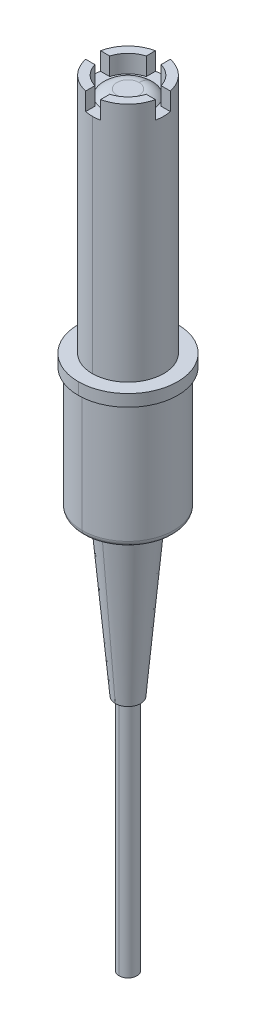
ISO-10303-21;
HEADER;
FILE_DESCRIPTION(('STEP AP214'),'2;1');
FILE_NAME('part.step','',(''),(''),'','','');
FILE_SCHEMA(('AUTOMOTIVE_DESIGN { 1 0 10303 214 1 1 1 1 }'));
ENDSEC;
DATA;
#1=APPLICATION_CONTEXT('core data for automotive mechanical design processes');
#2=APPLICATION_PROTOCOL_DEFINITION('international standard','automotive_design',2000,#1);
#3=PRODUCT_CONTEXT('',#1,'mechanical');
#4=PRODUCT('Part','Part','',(#3));
#5=PRODUCT_RELATED_PRODUCT_CATEGORY('part','',(#4));
#6=PRODUCT_DEFINITION_FORMATION('','',#4);
#7=PRODUCT_DEFINITION_CONTEXT('part definition',#1,'design');
#8=PRODUCT_DEFINITION('design','',#6,#7);
#9=PRODUCT_DEFINITION_SHAPE('','',#8);
#10=(LENGTH_UNIT() NAMED_UNIT(*) SI_UNIT(.MILLI.,.METRE.));
#11=(NAMED_UNIT(*) PLANE_ANGLE_UNIT() SI_UNIT($,.RADIAN.));
#12=(NAMED_UNIT(*) SI_UNIT($,.STERADIAN.) SOLID_ANGLE_UNIT());
#13=UNCERTAINTY_MEASURE_WITH_UNIT(LENGTH_MEASURE(1.E-05),#10,'distance_accuracy_value','');
#14=(GEOMETRIC_REPRESENTATION_CONTEXT(3) GLOBAL_UNCERTAINTY_ASSIGNED_CONTEXT((#13)) GLOBAL_UNIT_ASSIGNED_CONTEXT((#10,
#11,#12)) REPRESENTATION_CONTEXT('',''));
#15=CARTESIAN_POINT('',(0.,0.,0.));
#16=DIRECTION('',(0.,0.,1.));
#17=DIRECTION('',(1.,0.,0.));
#18=AXIS2_PLACEMENT_3D('',#15,#16,#17);
#19=CARTESIAN_POINT('',(0.,-67.,0.));
#20=DIRECTION('',(0.,-1.,0.));
#21=DIRECTION('',(0.,0.,-1.));
#22=AXIS2_PLACEMENT_3D('',#19,#20,#21);
#23=PLANE('',#22);
#24=CARTESIAN_POINT('',(0.,-67.,0.));
#25=DIRECTION('',(0.,-1.,0.));
#26=DIRECTION('',(0.,0.,-1.));
#27=AXIS2_PLACEMENT_3D('',#24,#25,#26);
#28=CIRCLE('',#27,1.5);
#29=CARTESIAN_POINT('',(0.,-67.,1.5));
#30=VERTEX_POINT('',#29);
#31=CARTESIAN_POINT('',(0.,-67.,-1.5));
#32=VERTEX_POINT('',#31);
#33=EDGE_CURVE('E10',#30,#32,#28,.T.);
#34=ORIENTED_EDGE('',*,*,#33,.T.);
#35=CARTESIAN_POINT('',(0.,-67.,0.));
#36=DIRECTION('',(0.,-1.,0.));
#37=DIRECTION('',(0.,0.,-1.));
#38=AXIS2_PLACEMENT_3D('',#35,#36,#37);
#39=CIRCLE('',#38,1.5);
#40=EDGE_CURVE('E340',#32,#30,#39,.T.);
#41=ORIENTED_EDGE('',*,*,#40,.T.);
#42=EDGE_LOOP('',(#34,#41));
#43=FACE_BOUND('',#42,.T.);
#44=ADVANCED_FACE('F16',(#43),#23,.T.);
#45=CARTESIAN_POINT('',(0.,-67.,0.));
#46=DIRECTION('',(0.,1.,0.));
#47=DIRECTION('',(0.,0.,1.));
#48=AXIS2_PLACEMENT_3D('',#45,#46,#47);
#49=CYLINDRICAL_SURFACE('',#48,1.5);
#50=DIRECTION('',(0.,1.,0.));
#51=VECTOR('',#50,1.);
#52=CARTESIAN_POINT('',(0.,-67.,-1.5));
#53=LINE('',#52,#51);
#54=CARTESIAN_POINT('',(0.,-27.,-1.5));
#55=VERTEX_POINT('',#54);
#56=EDGE_CURVE('E461',#32,#55,#53,.T.);
#57=ORIENTED_EDGE('',*,*,#56,.F.);
#58=ORIENTED_EDGE('',*,*,#33,.F.);
#59=DIRECTION('',(0.,1.,0.));
#60=VECTOR('',#59,1.);
#61=CARTESIAN_POINT('',(0.,-67.,1.5));
#62=LINE('',#61,#60);
#63=CARTESIAN_POINT('',(0.,-27.,1.5));
#64=VERTEX_POINT('',#63);
#65=EDGE_CURVE('E488',#30,#64,#62,.T.);
#66=ORIENTED_EDGE('',*,*,#65,.T.);
#67=CARTESIAN_POINT('',(0.,-27.,0.));
#68=DIRECTION('',(0.,-1.,0.));
#69=DIRECTION('',(0.,0.,-1.));
#70=AXIS2_PLACEMENT_3D('',#67,#68,#69);
#71=CIRCLE('',#70,1.5);
#72=EDGE_CURVE('E27',#64,#55,#71,.T.);
#73=ORIENTED_EDGE('',*,*,#72,.T.);
#74=EDGE_LOOP('',(#57,#58,#66,#73));
#75=FACE_BOUND('',#74,.T.);
#76=ADVANCED_FACE('F662',(#75),#49,.T.);
#77=CARTESIAN_POINT('',(0.,-27.,0.));
#78=DIRECTION('',(0.,-1.,0.));
#79=DIRECTION('',(0.,0.,-1.));
#80=AXIS2_PLACEMENT_3D('',#77,#78,#79);
#81=PLANE('',#80);
#82=ORIENTED_EDGE('',*,*,#72,.F.);
#83=CARTESIAN_POINT('',(0.,-27.,0.));
#84=DIRECTION('',(0.,-1.,0.));
#85=DIRECTION('',(0.,0.,-1.));
#86=AXIS2_PLACEMENT_3D('',#83,#84,#85);
#87=CIRCLE('',#86,1.5);
#88=EDGE_CURVE('E465',#55,#64,#87,.T.);
#89=ORIENTED_EDGE('',*,*,#88,.F.);
#90=EDGE_LOOP('',(#82,#89));
#91=FACE_BOUND('',#90,.T.);
#92=CARTESIAN_POINT('',(0.,-27.,0.));
#93=DIRECTION('',(0.,-1.,0.));
#94=DIRECTION('',(0.,0.,-1.));
#95=AXIS2_PLACEMENT_3D('',#92,#93,#94);
#96=CIRCLE('',#95,2.13780608480005);
#97=CARTESIAN_POINT('',(0.,-27.,-2.13780608480005));
#98=VERTEX_POINT('',#97);
#99=CARTESIAN_POINT('',(0.,-27.,2.13780608480005));
#100=VERTEX_POINT('',#99);
#101=EDGE_CURVE('E370',#98,#100,#96,.T.);
#102=ORIENTED_EDGE('',*,*,#101,.T.);
#103=CARTESIAN_POINT('',(0.,-27.,0.));
#104=DIRECTION('',(0.,-1.,0.));
#105=DIRECTION('',(0.,0.,-1.));
#106=AXIS2_PLACEMENT_3D('',#103,#104,#105);
#107=CIRCLE('',#106,2.13780608480005);
#108=EDGE_CURVE('E470',#100,#98,#107,.T.);
#109=ORIENTED_EDGE('',*,*,#108,.T.);
#110=EDGE_LOOP('',(#102,#109));
#111=FACE_BOUND('',#110,.T.);
#112=ADVANCED_FACE('F668',(#91,#111),#81,.T.);
#113=CARTESIAN_POINT('',(0.,0.,0.));
#114=DIRECTION('',(0.,1.,0.));
#115=DIRECTION('',(0.,0.,-1.));
#116=AXIS2_PLACEMENT_3D('',#113,#114,#115);
#117=CONICAL_SURFACE('',#116,4.5,0.0872664625997163);
#118=DIRECTION('',(0.,0.996194698091746,0.0871557427476582));
#119=VECTOR('',#118,1.);
#120=CARTESIAN_POINT('',(0.,0.,4.5));
#121=LINE('',#120,#119);
#122=CARTESIAN_POINT('',(0.,0.,4.5));
#123=VERTEX_POINT('',#122);
#124=EDGE_CURVE('E466',#100,#123,#121,.T.);
#125=ORIENTED_EDGE('',*,*,#124,.F.);
#126=ORIENTED_EDGE('',*,*,#101,.F.);
#127=DIRECTION('',(0.,0.996194698091746,-0.0871557427476582));
#128=VECTOR('',#127,1.);
#129=CARTESIAN_POINT('',(0.,0.,-4.5));
#130=LINE('',#129,#128);
#131=CARTESIAN_POINT('',(0.,0.,-4.5));
#132=VERTEX_POINT('',#131);
#133=EDGE_CURVE('E388',#98,#132,#130,.T.);
#134=ORIENTED_EDGE('',*,*,#133,.T.);
#135=CARTESIAN_POINT('',(0.,0.,0.));
#136=DIRECTION('',(0.,-1.,0.));
#137=DIRECTION('',(0.,0.,1.));
#138=AXIS2_PLACEMENT_3D('',#135,#136,#137);
#139=CIRCLE('',#138,4.5);
#140=EDGE_CURVE('E397',#132,#123,#139,.T.);
#141=ORIENTED_EDGE('',*,*,#140,.T.);
#142=EDGE_LOOP('',(#125,#126,#134,#141));
#143=FACE_BOUND('',#142,.T.);
#144=ADVANCED_FACE('F690',(#143),#117,.T.);
#145=CARTESIAN_POINT('',(0.,58.5,0.));
#146=DIRECTION('',(0.,-1.,0.));
#147=DIRECTION('',(0.,0.,-1.));
#148=AXIS2_PLACEMENT_3D('',#145,#146,#147);
#149=DEGENERATE_TOROIDAL_SURFACE('',#148,1.86393202250021,3.,.T.);
#150=CARTESIAN_POINT('',(0.,58.5,1.86393202250021));
#151=DIRECTION('',(1.,0.,0.));
#152=DIRECTION('',(0.,0.,-1.));
#153=AXIS2_PLACEMENT_3D('',#150,#151,#152);
#154=CIRCLE('',#153,3.);
#155=CARTESIAN_POINT('',(0.,61.5,1.86393202250021));
#156=VERTEX_POINT('',#155);
#157=CARTESIAN_POINT('',(0.,60.5,4.1));
#158=VERTEX_POINT('',#157);
#159=EDGE_CURVE('E421',#156,#158,#154,.T.);
#160=ORIENTED_EDGE('',*,*,#159,.F.);
#161=CARTESIAN_POINT('',(0.,61.5,0.));
#162=DIRECTION('',(0.,1.,0.));
#163=DIRECTION('',(0.,0.,1.));
#164=AXIS2_PLACEMENT_3D('',#161,#162,#163);
#165=CIRCLE('',#164,1.86393202250021);
#166=CARTESIAN_POINT('',(0.,61.5,-1.86393202250021));
#167=VERTEX_POINT('',#166);
#168=EDGE_CURVE('E579',#167,#156,#165,.T.);
#169=ORIENTED_EDGE('',*,*,#168,.F.);
#170=CARTESIAN_POINT('',(0.,58.5,-1.86393202250021));
#171=DIRECTION('',(-1.,0.,0.));
#172=DIRECTION('',(0.,0.,1.));
#173=AXIS2_PLACEMENT_3D('',#170,#171,#172);
#174=CIRCLE('',#173,3.);
#175=CARTESIAN_POINT('',(0.,60.5,-4.1));
#176=VERTEX_POINT('',#175);
#177=EDGE_CURVE('E492',#167,#176,#174,.T.);
#178=ORIENTED_EDGE('',*,*,#177,.T.);
#179=CARTESIAN_POINT('',(0.,60.5,0.));
#180=DIRECTION('',(0.,1.,0.));
#181=DIRECTION('',(0.,0.,1.));
#182=AXIS2_PLACEMENT_3D('',#179,#180,#181);
#183=CIRCLE('',#182,4.1);
#184=EDGE_CURVE('E456',#176,#158,#183,.T.);
#185=ORIENTED_EDGE('',*,*,#184,.T.);
#186=EDGE_LOOP('',(#160,#169,#178,#185));
#187=FACE_BOUND('',#186,.T.);
#188=ADVANCED_FACE('F685',(#187),#149,.T.);
#189=CARTESIAN_POINT('',(0.,61.5,0.));
#190=DIRECTION('',(0.,1.,0.));
#191=DIRECTION('',(1.,0.,0.));
#192=AXIS2_PLACEMENT_3D('',#189,#190,#191);
#193=PLANE('',#192);
#194=ORIENTED_EDGE('',*,*,#168,.T.);
#195=CARTESIAN_POINT('',(0.,61.5,0.));
#196=DIRECTION('',(0.,1.,0.));
#197=DIRECTION('',(0.,0.,1.));
#198=AXIS2_PLACEMENT_3D('',#195,#196,#197);
#199=CIRCLE('',#198,1.86393202250021);
#200=EDGE_CURVE('E392',#156,#167,#199,.T.);
#201=ORIENTED_EDGE('',*,*,#200,.T.);
#202=EDGE_LOOP('',(#194,#201));
#203=FACE_BOUND('',#202,.T.);
#204=ADVANCED_FACE('F673',(#203),#193,.T.);
#205=CARTESIAN_POINT('',(0.,60.5,1.25));
#206=DIRECTION('',(0.,0.,1.));
#207=DIRECTION('',(1.,0.,0.));
#208=AXIS2_PLACEMENT_3D('',#205,#206,#207);
#209=PLANE('',#208);
#210=DIRECTION('',(1.,0.,0.));
#211=VECTOR('',#210,1.);
#212=CARTESIAN_POINT('',(0.,63.5,1.25));
#213=LINE('',#212,#211);
#214=CARTESIAN_POINT('',(4.32290411644765,63.5,1.25));
#215=VERTEX_POINT('',#214);
#216=CARTESIAN_POINT('',(5.86834729715275,63.5,1.25));
#217=VERTEX_POINT('',#216);
#218=EDGE_CURVE('E277',#215,#217,#213,.T.);
#219=ORIENTED_EDGE('',*,*,#218,.T.);
#220=DIRECTION('',(0.,1.,0.));
#221=VECTOR('',#220,1.);
#222=CARTESIAN_POINT('',(5.86834729715275,60.5,1.25));
#223=LINE('',#222,#221);
#224=CARTESIAN_POINT('',(5.86834729715275,60.5,1.25));
#225=VERTEX_POINT('',#224);
#226=EDGE_CURVE('E358',#225,#217,#223,.T.);
#227=ORIENTED_EDGE('',*,*,#226,.F.);
#228=DIRECTION('',(1.,0.,0.));
#229=VECTOR('',#228,1.);
#230=CARTESIAN_POINT('',(0.,60.5,1.25));
#231=LINE('',#230,#229);
#232=CARTESIAN_POINT('',(4.32290411644765,60.5,1.25));
#233=VERTEX_POINT('',#232);
#234=EDGE_CURVE('E266',#233,#225,#231,.T.);
#235=ORIENTED_EDGE('',*,*,#234,.F.);
#236=DIRECTION('',(0.,1.,0.));
#237=VECTOR('',#236,1.);
#238=CARTESIAN_POINT('',(4.32290411644765,60.5,1.25));
#239=LINE('',#238,#237);
#240=EDGE_CURVE('E420',#233,#215,#239,.T.);
#241=ORIENTED_EDGE('',*,*,#240,.T.);
#242=EDGE_LOOP('',(#219,#227,#235,#241));
#243=FACE_BOUND('',#242,.T.);
#244=ADVANCED_FACE('F675',(#243),#209,.F.);
#245=CARTESIAN_POINT('',(0.,60.5,-1.25));
#246=DIRECTION('',(0.,0.,1.));
#247=DIRECTION('',(1.,0.,0.));
#248=AXIS2_PLACEMENT_3D('',#245,#246,#247);
#249=PLANE('',#248);
#250=DIRECTION('',(1.,0.,0.));
#251=VECTOR('',#250,1.);
#252=CARTESIAN_POINT('',(0.,63.5,-1.25));
#253=LINE('',#252,#251);
#254=CARTESIAN_POINT('',(4.32290411644765,63.5,-1.25));
#255=VERTEX_POINT('',#254);
#256=CARTESIAN_POINT('',(5.86834729715275,63.5,-1.25));
#257=VERTEX_POINT('',#256);
#258=EDGE_CURVE('E349',#255,#257,#253,.T.);
#259=ORIENTED_EDGE('',*,*,#258,.F.);
#260=DIRECTION('',(0.,1.,0.));
#261=VECTOR('',#260,1.);
#262=CARTESIAN_POINT('',(4.32290411644765,60.5,-1.25));
#263=LINE('',#262,#261);
#264=CARTESIAN_POINT('',(4.32290411644765,60.5,-1.25));
#265=VERTEX_POINT('',#264);
#266=EDGE_CURVE('E155',#265,#255,#263,.T.);
#267=ORIENTED_EDGE('',*,*,#266,.F.);
#268=DIRECTION('',(1.,0.,0.));
#269=VECTOR('',#268,1.);
#270=CARTESIAN_POINT('',(0.,60.5,-1.25));
#271=LINE('',#270,#269);
#272=CARTESIAN_POINT('',(5.86834729715275,60.5,-1.25));
#273=VERTEX_POINT('',#272);
#274=EDGE_CURVE('E396',#265,#273,#271,.T.);
#275=ORIENTED_EDGE('',*,*,#274,.T.);
#276=DIRECTION('',(0.,1.,0.));
#277=VECTOR('',#276,1.);
#278=CARTESIAN_POINT('',(5.86834729715275,60.5,-1.25));
#279=LINE('',#278,#277);
#280=EDGE_CURVE('E379',#273,#257,#279,.T.);
#281=ORIENTED_EDGE('',*,*,#280,.T.);
#282=EDGE_LOOP('',(#259,#267,#275,#281));
#283=FACE_BOUND('',#282,.T.);
#284=ADVANCED_FACE('F677',(#283),#249,.T.);
#285=CARTESIAN_POINT('',(1.25,60.5,0.));
#286=DIRECTION('',(1.,0.,0.));
#287=DIRECTION('',(0.,1.,0.));
#288=AXIS2_PLACEMENT_3D('',#285,#286,#287);
#289=PLANE('',#288);
#290=DIRECTION('',(0.,0.,-1.));
#291=VECTOR('',#290,1.);
#292=CARTESIAN_POINT('',(1.25,63.5,0.));
#293=LINE('',#292,#291);
#294=CARTESIAN_POINT('',(1.25,63.5,5.86834729715275));
#295=VERTEX_POINT('',#294);
#296=CARTESIAN_POINT('',(1.25,63.5,4.32290411644765));
#297=VERTEX_POINT('',#296);
#298=EDGE_CURVE('E506',#295,#297,#293,.T.);
#299=ORIENTED_EDGE('',*,*,#298,.T.);
#300=DIRECTION('',(0.,1.,0.));
#301=VECTOR('',#300,1.);
#302=CARTESIAN_POINT('',(1.25,60.5,4.32290411644765));
#303=LINE('',#302,#301);
#304=CARTESIAN_POINT('',(1.25,60.5,4.32290411644765));
#305=VERTEX_POINT('',#304);
#306=EDGE_CURVE('E354',#305,#297,#303,.T.);
#307=ORIENTED_EDGE('',*,*,#306,.F.);
#308=DIRECTION('',(0.,0.,-1.));
#309=VECTOR('',#308,1.);
#310=CARTESIAN_POINT('',(1.25,60.5,0.));
#311=LINE('',#310,#309);
#312=CARTESIAN_POINT('',(1.25,60.5,5.86834729715275));
#313=VERTEX_POINT('',#312);
#314=EDGE_CURVE('E42',#313,#305,#311,.T.);
#315=ORIENTED_EDGE('',*,*,#314,.F.);
#316=DIRECTION('',(0.,1.,0.));
#317=VECTOR('',#316,1.);
#318=CARTESIAN_POINT('',(1.25,60.5,5.86834729715275));
#319=LINE('',#318,#317);
#320=EDGE_CURVE('E434',#313,#295,#319,.T.);
#321=ORIENTED_EDGE('',*,*,#320,.T.);
#322=EDGE_LOOP('',(#299,#307,#315,#321));
#323=FACE_BOUND('',#322,.T.);
#324=ADVANCED_FACE('F682',(#323),#289,.F.);
#325=CARTESIAN_POINT('',(-1.25,60.5,0.));
#326=DIRECTION('',(1.,0.,0.));
#327=DIRECTION('',(0.,0.,-1.));
#328=AXIS2_PLACEMENT_3D('',#325,#326,#327);
#329=PLANE('',#328);
#330=DIRECTION('',(0.,0.,-1.));
#331=VECTOR('',#330,1.);
#332=CARTESIAN_POINT('',(-1.25,63.5,0.));
#333=LINE('',#332,#331);
#334=CARTESIAN_POINT('',(-1.25,63.5,5.86834729715275));
#335=VERTEX_POINT('',#334);
#336=CARTESIAN_POINT('',(-1.25,63.5,4.32290411644765));
#337=VERTEX_POINT('',#336);
#338=EDGE_CURVE('E341',#335,#337,#333,.T.);
#339=ORIENTED_EDGE('',*,*,#338,.F.);
#340=DIRECTION('',(0.,1.,0.));
#341=VECTOR('',#340,1.);
#342=CARTESIAN_POINT('',(-1.25,60.5,5.86834729715275));
#343=LINE('',#342,#341);
#344=CARTESIAN_POINT('',(-1.25,60.5,5.86834729715275));
#345=VERTEX_POINT('',#344);
#346=EDGE_CURVE('E538',#345,#335,#343,.T.);
#347=ORIENTED_EDGE('',*,*,#346,.F.);
#348=DIRECTION('',(0.,0.,-1.));
#349=VECTOR('',#348,1.);
#350=CARTESIAN_POINT('',(-1.25,60.5,0.));
#351=LINE('',#350,#349);
#352=CARTESIAN_POINT('',(-1.25,60.5,4.32290411644765));
#353=VERTEX_POINT('',#352);
#354=EDGE_CURVE('E20',#345,#353,#351,.T.);
#355=ORIENTED_EDGE('',*,*,#354,.T.);
#356=DIRECTION('',(0.,1.,0.));
#357=VECTOR('',#356,1.);
#358=CARTESIAN_POINT('',(-1.25,60.5,4.32290411644765));
#359=LINE('',#358,#357);
#360=EDGE_CURVE('E453',#353,#337,#359,.T.);
#361=ORIENTED_EDGE('',*,*,#360,.T.);
#362=EDGE_LOOP('',(#339,#347,#355,#361));
#363=FACE_BOUND('',#362,.T.);
#364=ADVANCED_FACE('F638',(#363),#329,.T.);
#365=CARTESIAN_POINT('',(-0.0055784842625831,60.5,1.26897914026433));
#366=DIRECTION('',(-0.00439599847134383,0.,0.999990337552038));
#367=DIRECTION('',(0.,1.,0.));
#368=AXIS2_PLACEMENT_3D('',#365,#366,#367);
#369=PLANE('',#368);
#370=DIRECTION('',(0.999990337552039,0.,0.00439599847134383));
#371=VECTOR('',#370,1.);
#372=CARTESIAN_POINT('',(-0.0055784842625831,63.5,1.26897914026433));
#373=LINE('',#372,#371);
#374=CARTESIAN_POINT('',(-5.86979166666667,63.5,1.2431998189875));
#375=VERTEX_POINT('',#374);
#376=CARTESIAN_POINT('',(-4.32290411644765,63.5,1.25));
#377=VERTEX_POINT('',#376);
#378=EDGE_CURVE('E313',#375,#377,#373,.T.);
#379=ORIENTED_EDGE('',*,*,#378,.T.);
#380=DIRECTION('',(0.,1.,0.));
#381=VECTOR('',#380,1.);
#382=CARTESIAN_POINT('',(-4.32290411644765,60.5,1.25));
#383=LINE('',#382,#381);
#384=CARTESIAN_POINT('',(-4.32290411644765,60.5,1.25));
#385=VERTEX_POINT('',#384);
#386=EDGE_CURVE('E440',#385,#377,#383,.T.);
#387=ORIENTED_EDGE('',*,*,#386,.F.);
#388=DIRECTION('',(0.999990337552039,0.,0.00439599847134383));
#389=VECTOR('',#388,1.);
#390=CARTESIAN_POINT('',(-0.0055784842625831,60.5,1.26897914026433));
#391=LINE('',#390,#389);
#392=CARTESIAN_POINT('',(-5.86979166666667,60.5,1.2431998189875));
#393=VERTEX_POINT('',#392);
#394=EDGE_CURVE('E568',#393,#385,#391,.T.);
#395=ORIENTED_EDGE('',*,*,#394,.F.);
#396=DIRECTION('',(0.,1.,0.));
#397=VECTOR('',#396,1.);
#398=CARTESIAN_POINT('',(-5.86979166666667,60.5,1.2431998189875));
#399=LINE('',#398,#397);
#400=EDGE_CURVE('E336',#393,#375,#399,.T.);
#401=ORIENTED_EDGE('',*,*,#400,.T.);
#402=EDGE_LOOP('',(#379,#387,#395,#401));
#403=FACE_BOUND('',#402,.T.);
#404=ADVANCED_FACE('F645',(#403),#369,.F.);
#405=CARTESIAN_POINT('',(0.,60.5,-1.25));
#406=DIRECTION('',(0.,0.,1.));
#407=DIRECTION('',(1.,0.,0.));
#408=AXIS2_PLACEMENT_3D('',#405,#406,#407);
#409=PLANE('',#408);
#410=DIRECTION('',(1.,0.,0.));
#411=VECTOR('',#410,1.);
#412=CARTESIAN_POINT('',(0.,63.5,-1.25));
#413=LINE('',#412,#411);
#414=CARTESIAN_POINT('',(-5.86834729715275,63.5,-1.25));
#415=VERTEX_POINT('',#414);
#416=CARTESIAN_POINT('',(-4.32290411644765,63.5,-1.25));
#417=VERTEX_POINT('',#416);
#418=EDGE_CURVE('E300',#415,#417,#413,.T.);
#419=ORIENTED_EDGE('',*,*,#418,.F.);
#420=DIRECTION('',(0.,1.,0.));
#421=VECTOR('',#420,1.);
#422=CARTESIAN_POINT('',(-5.86834729715275,60.5,-1.25));
#423=LINE('',#422,#421);
#424=CARTESIAN_POINT('',(-5.86834729715275,60.5,-1.25));
#425=VERTEX_POINT('',#424);
#426=EDGE_CURVE('E304',#425,#415,#423,.T.);
#427=ORIENTED_EDGE('',*,*,#426,.F.);
#428=DIRECTION('',(1.,0.,0.));
#429=VECTOR('',#428,1.);
#430=CARTESIAN_POINT('',(0.,60.5,-1.25));
#431=LINE('',#430,#429);
#432=CARTESIAN_POINT('',(-4.32290411644765,60.5,-1.25));
#433=VERTEX_POINT('',#432);
#434=EDGE_CURVE('E565',#425,#433,#431,.T.);
#435=ORIENTED_EDGE('',*,*,#434,.T.);
#436=DIRECTION('',(0.,1.,0.));
#437=VECTOR('',#436,1.);
#438=CARTESIAN_POINT('',(-4.32290411644765,60.5,-1.25));
#439=LINE('',#438,#437);
#440=EDGE_CURVE('E307',#433,#417,#439,.T.);
#441=ORIENTED_EDGE('',*,*,#440,.T.);
#442=EDGE_LOOP('',(#419,#427,#435,#441));
#443=FACE_BOUND('',#442,.T.);
#444=ADVANCED_FACE('F18',(#443),#409,.T.);
#445=CARTESIAN_POINT('',(1.25,60.5,0.));
#446=DIRECTION('',(1.,0.,0.));
#447=DIRECTION('',(0.,0.,-1.));
#448=AXIS2_PLACEMENT_3D('',#445,#446,#447);
#449=PLANE('',#448);
#450=DIRECTION('',(0.,0.,-1.));
#451=VECTOR('',#450,1.);
#452=CARTESIAN_POINT('',(1.25,63.5,0.));
#453=LINE('',#452,#451);
#454=CARTESIAN_POINT('',(1.25,63.5,-4.32290411644765));
#455=VERTEX_POINT('',#454);
#456=CARTESIAN_POINT('',(1.25,63.5,-5.86834729715275));
#457=VERTEX_POINT('',#456);
#458=EDGE_CURVE('E346',#455,#457,#453,.T.);
#459=ORIENTED_EDGE('',*,*,#458,.T.);
#460=DIRECTION('',(0.,1.,0.));
#461=VECTOR('',#460,1.);
#462=CARTESIAN_POINT('',(1.25,60.5,-5.86834729715275));
#463=LINE('',#462,#461);
#464=CARTESIAN_POINT('',(1.25,60.5,-5.86834729715275));
#465=VERTEX_POINT('',#464);
#466=EDGE_CURVE('E380',#465,#457,#463,.T.);
#467=ORIENTED_EDGE('',*,*,#466,.F.);
#468=DIRECTION('',(0.,0.,-1.));
#469=VECTOR('',#468,1.);
#470=CARTESIAN_POINT('',(1.25,60.5,0.));
#471=LINE('',#470,#469);
#472=CARTESIAN_POINT('',(1.25,60.5,-4.32290411644765));
#473=VERTEX_POINT('',#472);
#474=EDGE_CURVE('E112',#473,#465,#471,.T.);
#475=ORIENTED_EDGE('',*,*,#474,.F.);
#476=DIRECTION('',(0.,1.,0.));
#477=VECTOR('',#476,1.);
#478=CARTESIAN_POINT('',(1.25,60.5,-4.32290411644765));
#479=LINE('',#478,#477);
#480=EDGE_CURVE('E166',#473,#455,#479,.T.);
#481=ORIENTED_EDGE('',*,*,#480,.T.);
#482=EDGE_LOOP('',(#459,#467,#475,#481));
#483=FACE_BOUND('',#482,.T.);
#484=ADVANCED_FACE('F710',(#483),#449,.F.);
#485=CARTESIAN_POINT('',(-1.25,60.5,0.));
#486=DIRECTION('',(1.,0.,0.));
#487=DIRECTION('',(0.,1.,0.));
#488=AXIS2_PLACEMENT_3D('',#485,#486,#487);
#489=PLANE('',#488);
#490=DIRECTION('',(0.,0.,-1.));
#491=VECTOR('',#490,1.);
#492=CARTESIAN_POINT('',(-1.25,63.5,0.));
#493=LINE('',#492,#491);
#494=CARTESIAN_POINT('',(-1.25,63.5,-4.32290411644765));
#495=VERTEX_POINT('',#494);
#496=CARTESIAN_POINT('',(-1.25,63.5,-5.86834729715275));
#497=VERTEX_POINT('',#496);
#498=EDGE_CURVE('E319',#495,#497,#493,.T.);
#499=ORIENTED_EDGE('',*,*,#498,.F.);
#500=DIRECTION('',(0.,1.,0.));
#501=VECTOR('',#500,1.);
#502=CARTESIAN_POINT('',(-1.25,60.5,-4.32290411644765));
#503=LINE('',#502,#501);
#504=CARTESIAN_POINT('',(-1.25,60.5,-4.32290411644765));
#505=VERTEX_POINT('',#504);
#506=EDGE_CURVE('E447',#505,#495,#503,.T.);
#507=ORIENTED_EDGE('',*,*,#506,.F.);
#508=DIRECTION('',(0.,0.,-1.));
#509=VECTOR('',#508,1.);
#510=CARTESIAN_POINT('',(-1.25,60.5,0.));
#511=LINE('',#510,#509);
#512=CARTESIAN_POINT('',(-1.25,60.5,-5.86834729715275));
#513=VERTEX_POINT('',#512);
#514=EDGE_CURVE('E564',#505,#513,#511,.T.);
#515=ORIENTED_EDGE('',*,*,#514,.T.);
#516=DIRECTION('',(0.,1.,0.));
#517=VECTOR('',#516,1.);
#518=CARTESIAN_POINT('',(-1.25,60.5,-5.86834729715275));
#519=LINE('',#518,#517);
#520=EDGE_CURVE('E324',#513,#497,#519,.T.);
#521=ORIENTED_EDGE('',*,*,#520,.T.);
#522=EDGE_LOOP('',(#499,#507,#515,#521));
#523=FACE_BOUND('',#522,.T.);
#524=ADVANCED_FACE('F619',(#523),#489,.T.);
#525=CARTESIAN_POINT('',(0.,60.5,0.));
#526=DIRECTION('',(0.,1.,0.));
#527=DIRECTION('',(1.,0.,0.));
#528=AXIS2_PLACEMENT_3D('',#525,#526,#527);
#529=PLANE('',#528);
#530=ORIENTED_EDGE('',*,*,#184,.F.);
#531=CARTESIAN_POINT('',(0.,60.5,0.));
#532=DIRECTION('',(0.,1.,0.));
#533=DIRECTION('',(0.,0.,1.));
#534=AXIS2_PLACEMENT_3D('',#531,#532,#533);
#535=CIRCLE('',#534,4.1);
#536=EDGE_CURVE('E425',#158,#176,#535,.T.);
#537=ORIENTED_EDGE('',*,*,#536,.F.);
#538=EDGE_LOOP('',(#530,#537));
#539=FACE_BOUND('',#538,.T.);
#540=CARTESIAN_POINT('',(0.,60.5,0.));
#541=DIRECTION('',(0.,1.,0.));
#542=DIRECTION('',(0.,0.,1.));
#543=AXIS2_PLACEMENT_3D('',#540,#541,#542);
#544=CIRCLE('',#543,4.5);
#545=EDGE_CURVE('E407',#305,#233,#544,.T.);
#546=ORIENTED_EDGE('',*,*,#545,.T.);
#547=ORIENTED_EDGE('',*,*,#234,.T.);
#548=CARTESIAN_POINT('',(0.,60.5,0.));
#549=DIRECTION('',(0.,1.,0.));
#550=DIRECTION('',(0.,0.,1.));
#551=AXIS2_PLACEMENT_3D('',#548,#549,#550);
#552=CIRCLE('',#551,6.);
#553=EDGE_CURVE('E363',#225,#273,#552,.T.);
#554=ORIENTED_EDGE('',*,*,#553,.T.);
#555=ORIENTED_EDGE('',*,*,#274,.F.);
#556=CARTESIAN_POINT('',(0.,60.5,0.));
#557=DIRECTION('',(0.,1.,0.));
#558=DIRECTION('',(0.,0.,1.));
#559=AXIS2_PLACEMENT_3D('',#556,#557,#558);
#560=CIRCLE('',#559,4.5);
#561=EDGE_CURVE('E450',#265,#473,#560,.T.);
#562=ORIENTED_EDGE('',*,*,#561,.T.);
#563=ORIENTED_EDGE('',*,*,#474,.T.);
#564=CARTESIAN_POINT('',(0.,60.5,0.));
#565=DIRECTION('',(0.,1.,0.));
#566=DIRECTION('',(0.,0.,1.));
#567=AXIS2_PLACEMENT_3D('',#564,#565,#566);
#568=CIRCLE('',#567,6.);
#569=CARTESIAN_POINT('',(0.,60.5,-6.));
#570=VERTEX_POINT('',#569);
#571=EDGE_CURVE('E515',#465,#570,#568,.T.);
#572=ORIENTED_EDGE('',*,*,#571,.T.);
#573=CARTESIAN_POINT('',(0.,60.5,0.));
#574=DIRECTION('',(0.,1.,0.));
#575=DIRECTION('',(0.,0.,1.));
#576=AXIS2_PLACEMENT_3D('',#573,#574,#575);
#577=CIRCLE('',#576,6.);
#578=EDGE_CURVE('E367',#570,#513,#577,.T.);
#579=ORIENTED_EDGE('',*,*,#578,.T.);
#580=ORIENTED_EDGE('',*,*,#514,.F.);
#581=CARTESIAN_POINT('',(0.,60.5,0.));
#582=DIRECTION('',(0.,1.,0.));
#583=DIRECTION('',(0.,0.,1.));
#584=AXIS2_PLACEMENT_3D('',#581,#582,#583);
#585=CIRCLE('',#584,4.5);
#586=EDGE_CURVE('E439',#505,#433,#585,.T.);
#587=ORIENTED_EDGE('',*,*,#586,.T.);
#588=ORIENTED_EDGE('',*,*,#434,.F.);
#589=CARTESIAN_POINT('',(0.,60.5,0.));
#590=DIRECTION('',(0.,1.,0.));
#591=DIRECTION('',(0.,0.,1.));
#592=AXIS2_PLACEMENT_3D('',#589,#590,#591);
#593=CIRCLE('',#592,6.);
#594=EDGE_CURVE('E330',#425,#393,#593,.T.);
#595=ORIENTED_EDGE('',*,*,#594,.T.);
#596=ORIENTED_EDGE('',*,*,#394,.T.);
#597=CARTESIAN_POINT('',(0.,60.5,0.));
#598=DIRECTION('',(0.,1.,0.));
#599=DIRECTION('',(0.,0.,1.));
#600=AXIS2_PLACEMENT_3D('',#597,#598,#599);
#601=CIRCLE('',#600,4.5);
#602=EDGE_CURVE('E552',#385,#353,#601,.T.);
#603=ORIENTED_EDGE('',*,*,#602,.T.);
#604=ORIENTED_EDGE('',*,*,#354,.F.);
#605=CARTESIAN_POINT('',(0.,60.5,0.));
#606=DIRECTION('',(0.,1.,0.));
#607=DIRECTION('',(0.,0.,1.));
#608=AXIS2_PLACEMENT_3D('',#605,#606,#607);
#609=CIRCLE('',#608,6.);
#610=CARTESIAN_POINT('',(0.,60.5,6.));
#611=VERTEX_POINT('',#610);
#612=EDGE_CURVE('E460',#345,#611,#609,.T.);
#613=ORIENTED_EDGE('',*,*,#612,.T.);
#614=CARTESIAN_POINT('',(0.,60.5,0.));
#615=DIRECTION('',(0.,1.,0.));
#616=DIRECTION('',(0.,0.,1.));
#617=AXIS2_PLACEMENT_3D('',#614,#615,#616);
#618=CIRCLE('',#617,6.);
#619=EDGE_CURVE('E446',#611,#313,#618,.T.);
#620=ORIENTED_EDGE('',*,*,#619,.T.);
#621=ORIENTED_EDGE('',*,*,#314,.T.);
#622=EDGE_LOOP('',(#546,#547,#554,#555,#562,#563,#572,#579,#580,#587,#588,#595,#596,#603,#604,
#613,#620,#621));
#623=FACE_BOUND('',#622,.T.);
#624=ADVANCED_FACE('F614',(#539,#623),#529,.T.);
#625=CARTESIAN_POINT('',(0.,1.,0.));
#626=DIRECTION('',(0.,1.,0.));
#627=DIRECTION('',(0.,0.,1.));
#628=AXIS2_PLACEMENT_3D('',#625,#626,#627);
#629=TOROIDAL_SURFACE('',#628,6.7,1.);
#630=CARTESIAN_POINT('',(0.,1.,-6.7));
#631=DIRECTION('',(1.,0.,0.));
#632=DIRECTION('',(0.,0.,-1.));
#633=AXIS2_PLACEMENT_3D('',#630,#631,#632);
#634=CIRCLE('',#633,1.);
#635=CARTESIAN_POINT('',(0.,0.,-6.7));
#636=VERTEX_POINT('',#635);
#637=CARTESIAN_POINT('',(0.,1.,-7.7));
#638=VERTEX_POINT('',#637);
#639=EDGE_CURVE('E398',#636,#638,#634,.T.);
#640=ORIENTED_EDGE('',*,*,#639,.F.);
#641=CARTESIAN_POINT('',(0.,0.,0.));
#642=DIRECTION('',(0.,-1.,0.));
#643=DIRECTION('',(0.,0.,1.));
#644=AXIS2_PLACEMENT_3D('',#641,#642,#643);
#645=CIRCLE('',#644,6.7);
#646=CARTESIAN_POINT('',(0.,0.,6.7));
#647=VERTEX_POINT('',#646);
#648=EDGE_CURVE('E509',#647,#636,#645,.T.);
#649=ORIENTED_EDGE('',*,*,#648,.F.);
#650=CARTESIAN_POINT('',(0.,1.,6.7));
#651=DIRECTION('',(-1.,0.,0.));
#652=DIRECTION('',(0.,0.,1.));
#653=AXIS2_PLACEMENT_3D('',#650,#651,#652);
#654=CIRCLE('',#653,1.);
#655=CARTESIAN_POINT('',(0.,1.,7.7));
#656=VERTEX_POINT('',#655);
#657=EDGE_CURVE('E411',#647,#656,#654,.T.);
#658=ORIENTED_EDGE('',*,*,#657,.T.);
#659=CARTESIAN_POINT('',(0.,1.,0.));
#660=DIRECTION('',(0.,1.,0.));
#661=DIRECTION('',(0.,0.,1.));
#662=AXIS2_PLACEMENT_3D('',#659,#660,#661);
#663=CIRCLE('',#662,7.7);
#664=EDGE_CURVE('E374',#638,#656,#663,.T.);
#665=ORIENTED_EDGE('',*,*,#664,.F.);
#666=EDGE_LOOP('',(#640,#649,#658,#665));
#667=FACE_BOUND('',#666,.T.);
#668=ADVANCED_FACE('F701',(#667),#629,.T.);
#669=CARTESIAN_POINT('',(0.,0.,0.));
#670=DIRECTION('',(0.,1.,0.));
#671=DIRECTION('',(1.,0.,0.));
#672=AXIS2_PLACEMENT_3D('',#669,#670,#671);
#673=PLANE('',#672);
#674=ORIENTED_EDGE('',*,*,#140,.F.);
#675=CARTESIAN_POINT('',(0.,0.,0.));
#676=DIRECTION('',(0.,-1.,0.));
#677=DIRECTION('',(0.,0.,1.));
#678=AXIS2_PLACEMENT_3D('',#675,#676,#677);
#679=CIRCLE('',#678,4.5);
#680=EDGE_CURVE('E393',#123,#132,#679,.T.);
#681=ORIENTED_EDGE('',*,*,#680,.F.);
#682=EDGE_LOOP('',(#674,#681));
#683=FACE_BOUND('',#682,.T.);
#684=ORIENTED_EDGE('',*,*,#648,.T.);
#685=CARTESIAN_POINT('',(0.,0.,0.));
#686=DIRECTION('',(0.,-1.,0.));
#687=DIRECTION('',(0.,0.,1.));
#688=AXIS2_PLACEMENT_3D('',#685,#686,#687);
#689=CIRCLE('',#688,6.7);
#690=EDGE_CURVE('E403',#636,#647,#689,.T.);
#691=ORIENTED_EDGE('',*,*,#690,.T.);
#692=EDGE_LOOP('',(#684,#691));
#693=FACE_BOUND('',#692,.T.);
#694=ADVANCED_FACE('F707',(#683,#693),#673,.F.);
#695=CARTESIAN_POINT('',(0.,21.,0.));
#696=DIRECTION('',(0.,-1.,0.));
#697=DIRECTION('',(0.,0.,-1.));
#698=AXIS2_PLACEMENT_3D('',#695,#696,#697);
#699=CYLINDRICAL_SURFACE('',#698,7.7);
#700=DIRECTION('',(0.,-1.,0.));
#701=VECTOR('',#700,1.);
#702=CARTESIAN_POINT('',(0.,21.,7.7));
#703=LINE('',#702,#701);
#704=CARTESIAN_POINT('',(0.,21.,7.7));
#705=VERTEX_POINT('',#704);
#706=EDGE_CURVE('E412',#705,#656,#703,.T.);
#707=ORIENTED_EDGE('',*,*,#706,.F.);
#708=CARTESIAN_POINT('',(0.,21.,0.));
#709=DIRECTION('',(0.,-1.,0.));
#710=DIRECTION('',(0.,0.,-1.));
#711=AXIS2_PLACEMENT_3D('',#708,#709,#710);
#712=CIRCLE('',#711,7.7);
#713=CARTESIAN_POINT('',(0.,21.,-7.7));
#714=VERTEX_POINT('',#713);
#715=EDGE_CURVE('E371',#705,#714,#712,.T.);
#716=ORIENTED_EDGE('',*,*,#715,.T.);
#717=DIRECTION('',(0.,-1.,0.));
#718=VECTOR('',#717,1.);
#719=CARTESIAN_POINT('',(0.,21.,-7.7));
#720=LINE('',#719,#718);
#721=EDGE_CURVE('E416',#714,#638,#720,.T.);
#722=ORIENTED_EDGE('',*,*,#721,.T.);
#723=ORIENTED_EDGE('',*,*,#664,.T.);
#724=EDGE_LOOP('',(#707,#716,#722,#723));
#725=FACE_BOUND('',#724,.T.);
#726=ADVANCED_FACE('F730',(#725),#699,.T.);
#727=CARTESIAN_POINT('',(0.,21.,0.));
#728=DIRECTION('',(0.,-1.,0.));
#729=DIRECTION('',(0.,0.,-1.));
#730=AXIS2_PLACEMENT_3D('',#727,#728,#729);
#731=PLANE('',#730);
#732=CARTESIAN_POINT('',(0.,21.,0.));
#733=DIRECTION('',(0.,-1.,0.));
#734=DIRECTION('',(0.,0.,-1.));
#735=AXIS2_PLACEMENT_3D('',#732,#733,#734);
#736=CIRCLE('',#735,7.7);
#737=EDGE_CURVE('E417',#714,#705,#736,.T.);
#738=ORIENTED_EDGE('',*,*,#737,.F.);
#739=ORIENTED_EDGE('',*,*,#715,.F.);
#740=EDGE_LOOP('',(#738,#739));
#741=FACE_BOUND('',#740,.T.);
#742=CARTESIAN_POINT('',(0.,21.,0.));
#743=DIRECTION('',(0.,-1.,0.));
#744=DIRECTION('',(0.,0.,-1.));
#745=AXIS2_PLACEMENT_3D('',#742,#743,#744);
#746=CIRCLE('',#745,8.35);
#747=CARTESIAN_POINT('',(0.,21.,-8.35));
#748=VERTEX_POINT('',#747);
#749=CARTESIAN_POINT('',(0.,21.,8.35));
#750=VERTEX_POINT('',#749);
#751=EDGE_CURVE('E430',#748,#750,#746,.T.);
#752=ORIENTED_EDGE('',*,*,#751,.T.);
#753=CARTESIAN_POINT('',(0.,21.,0.));
#754=DIRECTION('',(0.,-1.,0.));
#755=DIRECTION('',(0.,0.,-1.));
#756=AXIS2_PLACEMENT_3D('',#753,#754,#755);
#757=CIRCLE('',#756,8.35);
#758=EDGE_CURVE('E353',#750,#748,#757,.T.);
#759=ORIENTED_EDGE('',*,*,#758,.T.);
#760=EDGE_LOOP('',(#752,#759));
#761=FACE_BOUND('',#760,.T.);
#762=ADVANCED_FACE('F767',(#741,#761),#731,.T.);
#763=CARTESIAN_POINT('',(0.,23.,0.));
#764=DIRECTION('',(0.,1.,0.));
#765=DIRECTION('',(1.,0.,0.));
#766=AXIS2_PLACEMENT_3D('',#763,#764,#765);
#767=PLANE('',#766);
#768=CARTESIAN_POINT('',(0.,23.,0.));
#769=DIRECTION('',(0.,1.,0.));
#770=DIRECTION('',(0.,0.,1.));
#771=AXIS2_PLACEMENT_3D('',#768,#769,#770);
#772=CIRCLE('',#771,6.);
#773=CARTESIAN_POINT('',(0.,23.,6.));
#774=VERTEX_POINT('',#773);
#775=CARTESIAN_POINT('',(0.,23.,-6.));
#776=VERTEX_POINT('',#775);
#777=EDGE_CURVE('E500',#774,#776,#772,.T.);
#778=ORIENTED_EDGE('',*,*,#777,.F.);
#779=CARTESIAN_POINT('',(0.,23.,0.));
#780=DIRECTION('',(0.,1.,0.));
#781=DIRECTION('',(0.,0.,1.));
#782=AXIS2_PLACEMENT_3D('',#779,#780,#781);
#783=CIRCLE('',#782,6.);
#784=EDGE_CURVE('E445',#776,#774,#783,.T.);
#785=ORIENTED_EDGE('',*,*,#784,.F.);
#786=EDGE_LOOP('',(#778,#785));
#787=FACE_BOUND('',#786,.T.);
#788=CARTESIAN_POINT('',(0.,23.,0.));
#789=DIRECTION('',(0.,1.,0.));
#790=DIRECTION('',(0.,0.,1.));
#791=AXIS2_PLACEMENT_3D('',#788,#789,#790);
#792=CIRCLE('',#791,8.35);
#793=CARTESIAN_POINT('',(0.,23.,-8.35));
#794=VERTEX_POINT('',#793);
#795=CARTESIAN_POINT('',(0.,23.,8.35));
#796=VERTEX_POINT('',#795);
#797=EDGE_CURVE('E350',#794,#796,#792,.T.);
#798=ORIENTED_EDGE('',*,*,#797,.T.);
#799=CARTESIAN_POINT('',(0.,23.,0.));
#800=DIRECTION('',(0.,1.,0.));
#801=DIRECTION('',(0.,0.,1.));
#802=AXIS2_PLACEMENT_3D('',#799,#800,#801);
#803=CIRCLE('',#802,8.35);
#804=EDGE_CURVE('E431',#796,#794,#803,.T.);
#805=ORIENTED_EDGE('',*,*,#804,.T.);
#806=EDGE_LOOP('',(#798,#805));
#807=FACE_BOUND('',#806,.T.);
#808=ADVANCED_FACE('F627',(#787,#807),#767,.T.);
#809=CARTESIAN_POINT('',(0.,63.5,0.));
#810=DIRECTION('',(0.,-1.,0.));
#811=DIRECTION('',(0.,0.,-1.));
#812=AXIS2_PLACEMENT_3D('',#809,#810,#811);
#813=CYLINDRICAL_SURFACE('',#812,8.35);
#814=DIRECTION('',(0.,-1.,0.));
#815=VECTOR('',#814,1.);
#816=CARTESIAN_POINT('',(0.,63.5,8.35));
#817=LINE('',#816,#815);
#818=EDGE_CURVE('E426',#796,#750,#817,.T.);
#819=ORIENTED_EDGE('',*,*,#818,.F.);
#820=ORIENTED_EDGE('',*,*,#797,.F.);
#821=DIRECTION('',(0.,-1.,0.));
#822=VECTOR('',#821,1.);
#823=CARTESIAN_POINT('',(0.,63.5,-8.35));
#824=LINE('',#823,#822);
#825=EDGE_CURVE('E496',#794,#748,#824,.T.);
#826=ORIENTED_EDGE('',*,*,#825,.T.);
#827=ORIENTED_EDGE('',*,*,#758,.F.);
#828=EDGE_LOOP('',(#819,#820,#826,#827));
#829=FACE_BOUND('',#828,.T.);
#830=ADVANCED_FACE('F724',(#829),#813,.T.);
#831=CARTESIAN_POINT('',(0.,60.5,0.));
#832=DIRECTION('',(0.,1.,0.));
#833=DIRECTION('',(0.,0.,1.));
#834=AXIS2_PLACEMENT_3D('',#831,#832,#833);
#835=CYLINDRICAL_SURFACE('',#834,4.5);
#836=CARTESIAN_POINT('',(0.,63.5,0.));
#837=DIRECTION('',(0.,1.,0.));
#838=DIRECTION('',(0.,0.,1.));
#839=AXIS2_PLACEMENT_3D('',#836,#837,#838);
#840=CIRCLE('',#839,4.5);
#841=EDGE_CURVE('E530',#297,#215,#840,.T.);
#842=ORIENTED_EDGE('',*,*,#841,.T.);
#843=ORIENTED_EDGE('',*,*,#240,.F.);
#844=ORIENTED_EDGE('',*,*,#545,.F.);
#845=ORIENTED_EDGE('',*,*,#306,.T.);
#846=EDGE_LOOP('',(#842,#843,#844,#845));
#847=FACE_BOUND('',#846,.T.);
#848=ADVANCED_FACE('F658',(#847),#835,.F.);
#849=CARTESIAN_POINT('',(0.,60.5,0.));
#850=DIRECTION('',(0.,1.,0.));
#851=DIRECTION('',(0.,0.,1.));
#852=AXIS2_PLACEMENT_3D('',#849,#850,#851);
#853=CYLINDRICAL_SURFACE('',#852,4.5);
#854=ORIENTED_EDGE('',*,*,#440,.F.);
#855=ORIENTED_EDGE('',*,*,#586,.F.);
#856=ORIENTED_EDGE('',*,*,#506,.T.);
#857=CARTESIAN_POINT('',(0.,63.5,0.));
#858=DIRECTION('',(0.,1.,0.));
#859=DIRECTION('',(0.,0.,1.));
#860=AXIS2_PLACEMENT_3D('',#857,#858,#859);
#861=CIRCLE('',#860,4.5);
#862=EDGE_CURVE('E312',#495,#417,#861,.T.);
#863=ORIENTED_EDGE('',*,*,#862,.T.);
#864=EDGE_LOOP('',(#854,#855,#856,#863));
#865=FACE_BOUND('',#864,.T.);
#866=ADVANCED_FACE('F617',(#865),#853,.F.);
#867=CARTESIAN_POINT('',(0.,60.5,0.));
#868=DIRECTION('',(0.,1.,0.));
#869=DIRECTION('',(0.,0.,1.));
#870=AXIS2_PLACEMENT_3D('',#867,#868,#869);
#871=CYLINDRICAL_SURFACE('',#870,4.5);
#872=ORIENTED_EDGE('',*,*,#360,.F.);
#873=ORIENTED_EDGE('',*,*,#602,.F.);
#874=ORIENTED_EDGE('',*,*,#386,.T.);
#875=CARTESIAN_POINT('',(0.,63.5,0.));
#876=DIRECTION('',(0.,1.,0.));
#877=DIRECTION('',(0.,0.,1.));
#878=AXIS2_PLACEMENT_3D('',#875,#876,#877);
#879=CIRCLE('',#878,4.5);
#880=EDGE_CURVE('E345',#377,#337,#879,.T.);
#881=ORIENTED_EDGE('',*,*,#880,.T.);
#882=EDGE_LOOP('',(#872,#873,#874,#881));
#883=FACE_BOUND('',#882,.T.);
#884=ADVANCED_FACE('F647',(#883),#871,.F.);
#885=CARTESIAN_POINT('',(0.,60.5,0.));
#886=DIRECTION('',(0.,1.,0.));
#887=DIRECTION('',(0.,0.,1.));
#888=AXIS2_PLACEMENT_3D('',#885,#886,#887);
#889=CYLINDRICAL_SURFACE('',#888,4.5);
#890=ORIENTED_EDGE('',*,*,#266,.T.);
#891=CARTESIAN_POINT('',(0.,63.5,0.));
#892=DIRECTION('',(0.,1.,0.));
#893=DIRECTION('',(0.,0.,1.));
#894=AXIS2_PLACEMENT_3D('',#891,#892,#893);
#895=CIRCLE('',#894,4.5);
#896=EDGE_CURVE('E364',#255,#455,#895,.T.);
#897=ORIENTED_EDGE('',*,*,#896,.T.);
#898=ORIENTED_EDGE('',*,*,#480,.F.);
#899=ORIENTED_EDGE('',*,*,#561,.F.);
#900=EDGE_LOOP('',(#890,#897,#898,#899));
#901=FACE_BOUND('',#900,.T.);
#902=ADVANCED_FACE('F649',(#901),#889,.F.);
#903=CARTESIAN_POINT('',(0.,63.5,0.));
#904=DIRECTION('',(0.,1.,0.));
#905=DIRECTION('',(1.,0.,0.));
#906=AXIS2_PLACEMENT_3D('',#903,#904,#905);
#907=PLANE('',#906);
#908=ORIENTED_EDGE('',*,*,#218,.F.);
#909=ORIENTED_EDGE('',*,*,#841,.F.);
#910=ORIENTED_EDGE('',*,*,#298,.F.);
#911=CARTESIAN_POINT('',(0.,63.5,0.));
#912=DIRECTION('',(0.,1.,0.));
#913=DIRECTION('',(0.,0.,1.));
#914=AXIS2_PLACEMENT_3D('',#911,#912,#913);
#915=CIRCLE('',#914,6.);
#916=EDGE_CURVE('E362',#295,#217,#915,.T.);
#917=ORIENTED_EDGE('',*,*,#916,.T.);
#918=EDGE_LOOP('',(#908,#909,#910,#917));
#919=FACE_BOUND('',#918,.T.);
#920=ADVANCED_FACE('F656',(#919),#907,.T.);
#921=CARTESIAN_POINT('',(0.,63.5,0.));
#922=DIRECTION('',(0.,1.,0.));
#923=DIRECTION('',(1.,0.,0.));
#924=AXIS2_PLACEMENT_3D('',#921,#922,#923);
#925=PLANE('',#924);
#926=CARTESIAN_POINT('',(0.,63.5,0.));
#927=DIRECTION('',(0.,1.,0.));
#928=DIRECTION('',(0.,0.,1.));
#929=AXIS2_PLACEMENT_3D('',#926,#927,#928);
#930=CIRCLE('',#929,6.);
#931=EDGE_CURVE('E316',#497,#415,#930,.T.);
#932=ORIENTED_EDGE('',*,*,#931,.T.);
#933=ORIENTED_EDGE('',*,*,#418,.T.);
#934=ORIENTED_EDGE('',*,*,#862,.F.);
#935=ORIENTED_EDGE('',*,*,#498,.T.);
#936=EDGE_LOOP('',(#932,#933,#934,#935));
#937=FACE_BOUND('',#936,.T.);
#938=ADVANCED_FACE('F317',(#937),#925,.T.);
#939=CARTESIAN_POINT('',(0.,63.5,0.));
#940=DIRECTION('',(0.,1.,0.));
#941=DIRECTION('',(1.,0.,0.));
#942=AXIS2_PLACEMENT_3D('',#939,#940,#941);
#943=PLANE('',#942);
#944=CARTESIAN_POINT('',(0.,63.5,0.));
#945=DIRECTION('',(0.,1.,0.));
#946=DIRECTION('',(0.,0.,1.));
#947=AXIS2_PLACEMENT_3D('',#944,#945,#946);
#948=CIRCLE('',#947,6.);
#949=EDGE_CURVE('E387',#375,#335,#948,.T.);
#950=ORIENTED_EDGE('',*,*,#949,.T.);
#951=ORIENTED_EDGE('',*,*,#338,.T.);
#952=ORIENTED_EDGE('',*,*,#880,.F.);
#953=ORIENTED_EDGE('',*,*,#378,.F.);
#954=EDGE_LOOP('',(#950,#951,#952,#953));
#955=FACE_BOUND('',#954,.T.);
#956=ADVANCED_FACE('F641',(#955),#943,.T.);
#957=CARTESIAN_POINT('',(0.,63.5,0.));
#958=DIRECTION('',(0.,1.,0.));
#959=DIRECTION('',(1.,0.,0.));
#960=AXIS2_PLACEMENT_3D('',#957,#958,#959);
#961=PLANE('',#960);
#962=ORIENTED_EDGE('',*,*,#896,.F.);
#963=ORIENTED_EDGE('',*,*,#258,.T.);
#964=CARTESIAN_POINT('',(0.,63.5,0.));
#965=DIRECTION('',(0.,1.,0.));
#966=DIRECTION('',(0.,0.,1.));
#967=AXIS2_PLACEMENT_3D('',#964,#965,#966);
#968=CIRCLE('',#967,6.);
#969=EDGE_CURVE('E375',#257,#457,#968,.T.);
#970=ORIENTED_EDGE('',*,*,#969,.T.);
#971=ORIENTED_EDGE('',*,*,#458,.F.);
#972=EDGE_LOOP('',(#962,#963,#970,#971));
#973=FACE_BOUND('',#972,.T.);
#974=ADVANCED_FACE('F720',(#973),#961,.T.);
#975=CARTESIAN_POINT('',(0.,23.,0.));
#976=DIRECTION('',(0.,1.,0.));
#977=DIRECTION('',(0.,0.,1.));
#978=AXIS2_PLACEMENT_3D('',#975,#976,#977);
#979=CYLINDRICAL_SURFACE('',#978,6.);
#980=DIRECTION('',(0.,1.,0.));
#981=VECTOR('',#980,1.);
#982=CARTESIAN_POINT('',(0.,23.,-6.));
#983=LINE('',#982,#981);
#984=EDGE_CURVE('E545',#776,#570,#983,.T.);
#985=ORIENTED_EDGE('',*,*,#984,.F.);
#986=ORIENTED_EDGE('',*,*,#784,.T.);
#987=DIRECTION('',(0.,1.,0.));
#988=VECTOR('',#987,1.);
#989=CARTESIAN_POINT('',(0.,23.,6.));
#990=LINE('',#989,#988);
#991=EDGE_CURVE('E441',#774,#611,#990,.T.);
#992=ORIENTED_EDGE('',*,*,#991,.T.);
#993=ORIENTED_EDGE('',*,*,#612,.F.);
#994=ORIENTED_EDGE('',*,*,#346,.T.);
#995=ORIENTED_EDGE('',*,*,#949,.F.);
#996=ORIENTED_EDGE('',*,*,#400,.F.);
#997=ORIENTED_EDGE('',*,*,#594,.F.);
#998=ORIENTED_EDGE('',*,*,#426,.T.);
#999=ORIENTED_EDGE('',*,*,#931,.F.);
#1000=ORIENTED_EDGE('',*,*,#520,.F.);
#1001=ORIENTED_EDGE('',*,*,#578,.F.);
#1002=EDGE_LOOP('',(#985,#986,#992,#993,#994,#995,#996,#997,#998,#999,#1000,#1001));
#1003=FACE_BOUND('',#1002,.T.);
#1004=ADVANCED_FACE('F327',(#1003),#979,.T.);
#1005=CARTESIAN_POINT('',(0.,23.,0.));
#1006=DIRECTION('',(0.,1.,0.));
#1007=DIRECTION('',(0.,0.,1.));
#1008=AXIS2_PLACEMENT_3D('',#1005,#1006,#1007);
#1009=CYLINDRICAL_SURFACE('',#1008,6.);
#1010=ORIENTED_EDGE('',*,*,#777,.T.);
#1011=ORIENTED_EDGE('',*,*,#984,.T.);
#1012=ORIENTED_EDGE('',*,*,#571,.F.);
#1013=ORIENTED_EDGE('',*,*,#466,.T.);
#1014=ORIENTED_EDGE('',*,*,#969,.F.);
#1015=ORIENTED_EDGE('',*,*,#280,.F.);
#1016=ORIENTED_EDGE('',*,*,#553,.F.);
#1017=ORIENTED_EDGE('',*,*,#226,.T.);
#1018=ORIENTED_EDGE('',*,*,#916,.F.);
#1019=ORIENTED_EDGE('',*,*,#320,.F.);
#1020=ORIENTED_EDGE('',*,*,#619,.F.);
#1021=ORIENTED_EDGE('',*,*,#991,.F.);
#1022=EDGE_LOOP('',(#1010,#1011,#1012,#1013,#1014,#1015,#1016,#1017,#1018,#1019,#1020,#1021));
#1023=FACE_BOUND('',#1022,.T.);
#1024=ADVANCED_FACE('F622',(#1023),#1009,.T.);
#1025=CARTESIAN_POINT('',(0.,63.5,0.));
#1026=DIRECTION('',(0.,-1.,0.));
#1027=DIRECTION('',(0.,0.,-1.));
#1028=AXIS2_PLACEMENT_3D('',#1025,#1026,#1027);
#1029=CYLINDRICAL_SURFACE('',#1028,8.35);
#1030=ORIENTED_EDGE('',*,*,#804,.F.);
#1031=ORIENTED_EDGE('',*,*,#818,.T.);
#1032=ORIENTED_EDGE('',*,*,#751,.F.);
#1033=ORIENTED_EDGE('',*,*,#825,.F.);
#1034=EDGE_LOOP('',(#1030,#1031,#1032,#1033));
#1035=FACE_BOUND('',#1034,.T.);
#1036=ADVANCED_FACE('F722',(#1035),#1029,.T.);
#1037=CARTESIAN_POINT('',(0.,21.,0.));
#1038=DIRECTION('',(0.,-1.,0.));
#1039=DIRECTION('',(0.,0.,-1.));
#1040=AXIS2_PLACEMENT_3D('',#1037,#1038,#1039);
#1041=CYLINDRICAL_SURFACE('',#1040,7.7);
#1042=ORIENTED_EDGE('',*,*,#737,.T.);
#1043=ORIENTED_EDGE('',*,*,#706,.T.);
#1044=CARTESIAN_POINT('',(0.,1.,0.));
#1045=DIRECTION('',(0.,1.,0.));
#1046=DIRECTION('',(0.,0.,1.));
#1047=AXIS2_PLACEMENT_3D('',#1044,#1045,#1046);
#1048=CIRCLE('',#1047,7.7);
#1049=EDGE_CURVE('E402',#656,#638,#1048,.T.);
#1050=ORIENTED_EDGE('',*,*,#1049,.T.);
#1051=ORIENTED_EDGE('',*,*,#721,.F.);
#1052=EDGE_LOOP('',(#1042,#1043,#1050,#1051));
#1053=FACE_BOUND('',#1052,.T.);
#1054=ADVANCED_FACE('F737',(#1053),#1041,.T.);
#1055=CARTESIAN_POINT('',(0.,1.,0.));
#1056=DIRECTION('',(0.,1.,0.));
#1057=DIRECTION('',(0.,0.,1.));
#1058=AXIS2_PLACEMENT_3D('',#1055,#1056,#1057);
#1059=TOROIDAL_SURFACE('',#1058,6.7,1.);
#1060=ORIENTED_EDGE('',*,*,#690,.F.);
#1061=ORIENTED_EDGE('',*,*,#639,.T.);
#1062=ORIENTED_EDGE('',*,*,#1049,.F.);
#1063=ORIENTED_EDGE('',*,*,#657,.F.);
#1064=EDGE_LOOP('',(#1060,#1061,#1062,#1063));
#1065=FACE_BOUND('',#1064,.T.);
#1066=ADVANCED_FACE('F714',(#1065),#1059,.T.);
#1067=CARTESIAN_POINT('',(0.,58.5,0.));
#1068=DIRECTION('',(0.,-1.,0.));
#1069=DIRECTION('',(0.,0.,-1.));
#1070=AXIS2_PLACEMENT_3D('',#1067,#1068,#1069);
#1071=DEGENERATE_TOROIDAL_SURFACE('',#1070,1.86393202250021,3.,.T.);
#1072=ORIENTED_EDGE('',*,*,#200,.F.);
#1073=ORIENTED_EDGE('',*,*,#159,.T.);
#1074=ORIENTED_EDGE('',*,*,#536,.T.);
#1075=ORIENTED_EDGE('',*,*,#177,.F.);
#1076=EDGE_LOOP('',(#1072,#1073,#1074,#1075));
#1077=FACE_BOUND('',#1076,.T.);
#1078=ADVANCED_FACE('F698',(#1077),#1071,.T.);
#1079=CARTESIAN_POINT('',(0.,0.,0.));
#1080=DIRECTION('',(0.,1.,0.));
#1081=DIRECTION('',(0.,0.,-1.));
#1082=AXIS2_PLACEMENT_3D('',#1079,#1080,#1081);
#1083=CONICAL_SURFACE('',#1082,4.5,0.0872664625997163);
#1084=ORIENTED_EDGE('',*,*,#108,.F.);
#1085=ORIENTED_EDGE('',*,*,#124,.T.);
#1086=ORIENTED_EDGE('',*,*,#680,.T.);
#1087=ORIENTED_EDGE('',*,*,#133,.F.);
#1088=EDGE_LOOP('',(#1084,#1085,#1086,#1087));
#1089=FACE_BOUND('',#1088,.T.);
#1090=ADVANCED_FACE('F762',(#1089),#1083,.T.);
#1091=CARTESIAN_POINT('',(0.,-67.,0.));
#1092=DIRECTION('',(0.,1.,0.));
#1093=DIRECTION('',(0.,0.,1.));
#1094=AXIS2_PLACEMENT_3D('',#1091,#1092,#1093);
#1095=CYLINDRICAL_SURFACE('',#1094,1.5);
#1096=ORIENTED_EDGE('',*,*,#40,.F.);
#1097=ORIENTED_EDGE('',*,*,#56,.T.);
#1098=ORIENTED_EDGE('',*,*,#88,.T.);
#1099=ORIENTED_EDGE('',*,*,#65,.F.);
#1100=EDGE_LOOP('',(#1096,#1097,#1098,#1099));
#1101=FACE_BOUND('',#1100,.T.);
#1102=ADVANCED_FACE('F765',(#1101),#1095,.T.);
#1103=CLOSED_SHELL('',(#44,#76,#112,#144,#188,#204,#244,#284,#324,#364,#404,#444,#484,#524,#624,
#668,#694,#726,#762,#808,#830,#848,#866,#884,#902,#920,#938,#956,#974,#1004,#1024,#1036,#1054,
#1066,#1078,#1090,#1102));
#1104=MANIFOLD_SOLID_BREP('B1',#1103);
#1105=ADVANCED_BREP_SHAPE_REPRESENTATION('',(#18,#1104),#14);
#1106=SHAPE_DEFINITION_REPRESENTATION(#9,#1105);
ENDSEC;
END-ISO-10303-21;
